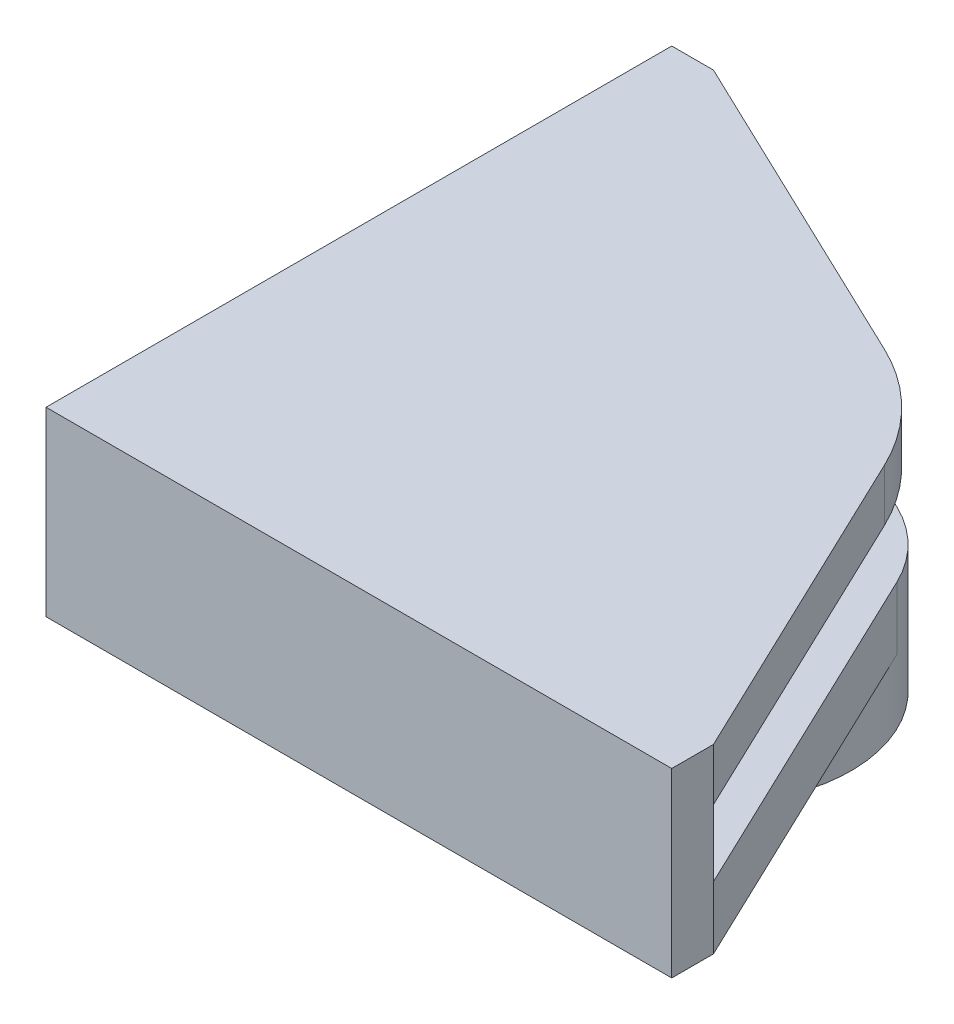
ISO-10303-21;
HEADER;
FILE_DESCRIPTION(('STEP AP214'),'2;1');
FILE_NAME('part.step','',(''),(''),'','','');
FILE_SCHEMA(('AUTOMOTIVE_DESIGN { 1 0 10303 214 1 1 1 1 }'));
ENDSEC;
DATA;
#1=APPLICATION_CONTEXT('core data for automotive mechanical design processes');
#2=APPLICATION_PROTOCOL_DEFINITION('international standard','automotive_design',2000,#1);
#3=PRODUCT_CONTEXT('',#1,'mechanical');
#4=PRODUCT('Part','Part','',(#3));
#5=PRODUCT_RELATED_PRODUCT_CATEGORY('part','',(#4));
#6=PRODUCT_DEFINITION_FORMATION('','',#4);
#7=PRODUCT_DEFINITION_CONTEXT('part definition',#1,'design');
#8=PRODUCT_DEFINITION('design','',#6,#7);
#9=PRODUCT_DEFINITION_SHAPE('','',#8);
#10=(LENGTH_UNIT() NAMED_UNIT(*) SI_UNIT(.MILLI.,.METRE.));
#11=(NAMED_UNIT(*) PLANE_ANGLE_UNIT() SI_UNIT($,.RADIAN.));
#12=(NAMED_UNIT(*) SI_UNIT($,.STERADIAN.) SOLID_ANGLE_UNIT());
#13=UNCERTAINTY_MEASURE_WITH_UNIT(LENGTH_MEASURE(1.E-05),#10,'distance_accuracy_value','');
#14=(GEOMETRIC_REPRESENTATION_CONTEXT(3) GLOBAL_UNCERTAINTY_ASSIGNED_CONTEXT((#13)) GLOBAL_UNIT_ASSIGNED_CONTEXT((#10,
#11,#12)) REPRESENTATION_CONTEXT('',''));
#15=CARTESIAN_POINT('',(0.,0.,0.));
#16=DIRECTION('',(0.,0.,1.));
#17=DIRECTION('',(1.,0.,0.));
#18=AXIS2_PLACEMENT_3D('',#15,#16,#17);
#19=CARTESIAN_POINT('',(14.0000000000001,3.1,-13.9999999999997));
#20=DIRECTION('',(0.,-1.,0.));
#21=DIRECTION('',(0.,0.,-1.));
#22=AXIS2_PLACEMENT_3D('',#19,#20,#21);
#23=CYLINDRICAL_SURFACE('',#22,5.1);
#24=CARTESIAN_POINT('',(14.0000000000001,3.1,-13.9999999999997));
#25=DIRECTION('',(0.,1.,0.));
#26=DIRECTION('',(0.,0.,1.));
#27=AXIS2_PLACEMENT_3D('',#24,#25,#26);
#28=CIRCLE('',#27,5.1);
#29=CARTESIAN_POINT('',(14.0000000000001,3.1,-19.0999999999997));
#30=VERTEX_POINT('',#29);
#31=EDGE_CURVE('E143',#30,#30,#28,.T.);
#32=CARTESIAN_POINT('',(14.0000000000001,0.,-13.9999999999997));
#33=DIRECTION('',(0.,1.,0.));
#34=DIRECTION('',(0.,0.,1.));
#35=AXIS2_PLACEMENT_3D('',#32,#33,#34);
#36=CIRCLE('',#35,5.1);
#37=CARTESIAN_POINT('',(14.0000000000001,0.,-19.0999999999997));
#38=VERTEX_POINT('',#37);
#39=EDGE_CURVE('E199',#38,#38,#36,.T.);
#40=CARTESIAN_POINT('',(14.0000000000001,3.1,-19.0999999999997));
#41=CARTESIAN_POINT('',(14.0000000000001,3.06770833333333,-19.0999999999997));
#42=CARTESIAN_POINT('',(14.0000000000001,3.03541666666667,-19.0999999999997));
#43=CARTESIAN_POINT('',(14.0000000000001,2.97083333333333,-19.0999999999997));
#44=CARTESIAN_POINT('',(14.0000000000001,2.93854166666667,-19.0999999999997));
#45=CARTESIAN_POINT('',(14.0000000000001,2.87395833333333,-19.0999999999997));
#46=CARTESIAN_POINT('',(14.0000000000001,2.84166666666667,-19.0999999999997));
#47=CARTESIAN_POINT('',(14.0000000000001,2.77708333333333,-19.0999999999997));
#48=CARTESIAN_POINT('',(14.0000000000001,2.74479166666667,-19.0999999999997));
#49=CARTESIAN_POINT('',(14.0000000000001,2.68020833333333,-19.0999999999997));
#50=CARTESIAN_POINT('',(14.0000000000001,2.64791666666667,-19.0999999999997));
#51=CARTESIAN_POINT('',(14.0000000000001,2.58333333333333,-19.0999999999997));
#52=CARTESIAN_POINT('',(14.0000000000001,2.55104166666667,-19.0999999999997));
#53=CARTESIAN_POINT('',(14.0000000000001,2.48645833333333,-19.0999999999997));
#54=CARTESIAN_POINT('',(14.0000000000001,2.45416666666667,-19.0999999999997));
#55=CARTESIAN_POINT('',(14.0000000000001,2.38958333333333,-19.0999999999997));
#56=CARTESIAN_POINT('',(14.0000000000001,2.35729166666667,-19.0999999999997));
#57=CARTESIAN_POINT('',(14.0000000000001,2.29270833333333,-19.0999999999997));
#58=CARTESIAN_POINT('',(14.0000000000001,2.26041666666667,-19.0999999999997));
#59=CARTESIAN_POINT('',(14.0000000000001,2.19583333333333,-19.0999999999997));
#60=CARTESIAN_POINT('',(14.0000000000001,2.16354166666667,-19.0999999999997));
#61=CARTESIAN_POINT('',(14.0000000000001,2.09895833333333,-19.0999999999997));
#62=CARTESIAN_POINT('',(14.0000000000001,2.06666666666667,-19.0999999999997));
#63=CARTESIAN_POINT('',(14.0000000000001,2.00208333333333,-19.0999999999997));
#64=CARTESIAN_POINT('',(14.0000000000001,1.96979166666667,-19.0999999999997));
#65=CARTESIAN_POINT('',(14.0000000000001,1.90520833333333,-19.0999999999997));
#66=CARTESIAN_POINT('',(14.0000000000001,1.87291666666667,-19.0999999999997));
#67=CARTESIAN_POINT('',(14.0000000000001,1.80833333333333,-19.0999999999997));
#68=CARTESIAN_POINT('',(14.0000000000001,1.77604166666667,-19.0999999999997));
#69=CARTESIAN_POINT('',(14.0000000000001,1.71145833333333,-19.0999999999997));
#70=CARTESIAN_POINT('',(14.0000000000001,1.67916666666667,-19.0999999999997));
#71=CARTESIAN_POINT('',(14.0000000000001,1.61458333333333,-19.0999999999997));
#72=CARTESIAN_POINT('',(14.0000000000001,1.58229166666667,-19.0999999999997));
#73=CARTESIAN_POINT('',(14.0000000000001,1.51770833333333,-19.0999999999997));
#74=CARTESIAN_POINT('',(14.0000000000001,1.48541666666667,-19.0999999999997));
#75=CARTESIAN_POINT('',(14.0000000000001,1.42083333333333,-19.0999999999997));
#76=CARTESIAN_POINT('',(14.0000000000001,1.38854166666667,-19.0999999999997));
#77=CARTESIAN_POINT('',(14.0000000000001,1.32395833333333,-19.0999999999997));
#78=CARTESIAN_POINT('',(14.0000000000001,1.29166666666667,-19.0999999999997));
#79=CARTESIAN_POINT('',(14.0000000000001,1.22708333333333,-19.0999999999997));
#80=CARTESIAN_POINT('',(14.0000000000001,1.19479166666667,-19.0999999999997));
#81=CARTESIAN_POINT('',(14.0000000000001,1.13020833333333,-19.0999999999997));
#82=CARTESIAN_POINT('',(14.0000000000001,1.09791666666667,-19.0999999999997));
#83=CARTESIAN_POINT('',(14.0000000000001,1.03333333333333,-19.0999999999997));
#84=CARTESIAN_POINT('',(14.0000000000001,1.00104166666667,-19.0999999999997));
#85=CARTESIAN_POINT('',(14.0000000000001,0.936458333333333,-19.0999999999997));
#86=CARTESIAN_POINT('',(14.0000000000001,0.904166666666667,-19.0999999999997));
#87=CARTESIAN_POINT('',(14.0000000000001,0.839583333333334,-19.0999999999997));
#88=CARTESIAN_POINT('',(14.0000000000001,0.807291666666667,-19.0999999999997));
#89=CARTESIAN_POINT('',(14.0000000000001,0.742708333333333,-19.0999999999997));
#90=CARTESIAN_POINT('',(14.0000000000001,0.710416666666667,-19.0999999999997));
#91=CARTESIAN_POINT('',(14.0000000000001,0.645833333333333,-19.0999999999997));
#92=CARTESIAN_POINT('',(14.0000000000001,0.613541666666667,-19.0999999999997));
#93=CARTESIAN_POINT('',(14.0000000000001,0.548958333333333,-19.0999999999997));
#94=CARTESIAN_POINT('',(14.0000000000001,0.516666666666667,-19.0999999999997));
#95=CARTESIAN_POINT('',(14.0000000000001,0.452083333333333,-19.0999999999997));
#96=CARTESIAN_POINT('',(14.0000000000001,0.419791666666667,-19.0999999999997));
#97=CARTESIAN_POINT('',(14.0000000000001,0.355208333333333,-19.0999999999997));
#98=CARTESIAN_POINT('',(14.0000000000001,0.322916666666667,-19.0999999999997));
#99=CARTESIAN_POINT('',(14.0000000000001,0.258333333333333,-19.0999999999997));
#100=CARTESIAN_POINT('',(14.0000000000001,0.226041666666667,-19.0999999999997));
#101=CARTESIAN_POINT('',(14.0000000000001,0.161458333333333,-19.0999999999997));
#102=CARTESIAN_POINT('',(14.0000000000001,0.129166666666667,-19.0999999999997));
#103=CARTESIAN_POINT('',(14.0000000000001,0.0645833333333335,-19.0999999999997));
#104=CARTESIAN_POINT('',(14.0000000000001,0.0322916666666667,-19.0999999999997));
#105=CARTESIAN_POINT('',(14.0000000000001,0.,-19.0999999999997));
#106=B_SPLINE_CURVE_WITH_KNOTS('',3,(#40,#41,#42,#43,#44,#45,#46,#47,#48,#49,#50,#51,#52,#53,
#54,#55,#56,#57,#58,#59,#60,#61,#62,#63,#64,#65,#66,#67,#68,#69,#70,#71,#72,#73,#74,#75,#76,#77,
#78,#79,#80,#81,#82,#83,#84,#85,#86,#87,#88,#89,#90,#91,#92,#93,#94,#95,#96,#97,#98,#99,#100,
#101,#102,#103,#104,#105),.UNSPECIFIED.,.F.,.F.,(4,2,2,2,2,2,2,2,2,2,2,2,2,2,2,2,2,2,2,2,2,2,2,
2,2,2,2,2,2,2,2,2,4),(0.,0.0968750000000002,0.19375,0.290625,0.3875,0.484375,0.58125,0.678125,
0.775,0.871875,0.96875,1.065625,1.1625,1.259375,1.35625,1.453125,1.55,1.646875,1.74375,1.840625,
1.9375,2.034375,2.13125,2.228125,2.325,2.421875,2.51875,2.615625,2.7125,2.809375,2.90625,
3.003125,3.1),.UNSPECIFIED.);
#107=EDGE_CURVE('BSEAM61',#30,#38,#106,.T.);
#108=ORIENTED_EDGE('',*,*,#31,.T.);
#109=ORIENTED_EDGE('',*,*,#39,.F.);
#110=ORIENTED_EDGE('',*,*,#107,.T.);
#111=ORIENTED_EDGE('',*,*,#107,.F.);
#112=EDGE_LOOP('',(#108,#110,#109,#111));
#113=FACE_BOUND('',#112,.T.);
#114=ADVANCED_FACE('F61',(#113),#23,.F.);
#115=CARTESIAN_POINT('',(14.0000000000001,3.1,-13.9999999999997));
#116=DIRECTION('',(0.,-1.,0.));
#117=DIRECTION('',(0.,0.,-1.));
#118=AXIS2_PLACEMENT_3D('',#115,#116,#117);
#119=CYLINDRICAL_SURFACE('',#118,6.6);
#120=CARTESIAN_POINT('',(14.0000000000001,3.1,-13.9999999999997));
#121=DIRECTION('',(0.,1.,0.));
#122=DIRECTION('',(0.,0.,1.));
#123=AXIS2_PLACEMENT_3D('',#120,#121,#122);
#124=CIRCLE('',#123,6.6);
#125=CARTESIAN_POINT('',(16.8442576529718,3.1,-19.9556862244001));
#126=VERTEX_POINT('',#125);
#127=CARTESIAN_POINT('',(19.9556862244004,3.1,-16.8442576529715));
#128=VERTEX_POINT('',#127);
#129=EDGE_CURVE('E12',#126,#128,#124,.T.);
#130=ORIENTED_EDGE('',*,*,#129,.F.);
#131=DIRECTION('',(0.,-1.,0.));
#132=VECTOR('',#131,1.);
#133=CARTESIAN_POINT('',(16.8442576529718,6.1,-19.9556862244001));
#134=LINE('',#133,#132);
#135=CARTESIAN_POINT('',(16.8442576529718,6.1,-19.9556862244001));
#136=VERTEX_POINT('',#135);
#137=EDGE_CURVE('E195',#136,#126,#134,.T.);
#138=ORIENTED_EDGE('',*,*,#137,.F.);
#139=CARTESIAN_POINT('',(14.0000000000001,6.1,-13.9999999999997));
#140=DIRECTION('',(0.,1.,0.));
#141=DIRECTION('',(0.,0.,1.));
#142=AXIS2_PLACEMENT_3D('',#139,#140,#141);
#143=CIRCLE('',#142,6.6);
#144=CARTESIAN_POINT('',(19.9556862244004,6.1,-16.8442576529715));
#145=VERTEX_POINT('',#144);
#146=EDGE_CURVE('E323',#145,#136,#143,.T.);
#147=ORIENTED_EDGE('',*,*,#146,.F.);
#148=DIRECTION('',(0.,-1.,0.));
#149=VECTOR('',#148,1.);
#150=CARTESIAN_POINT('',(19.9556862244004,6.1,-16.8442576529715));
#151=LINE('',#150,#149);
#152=EDGE_CURVE('E118',#145,#128,#151,.T.);
#153=ORIENTED_EDGE('',*,*,#152,.T.);
#154=EDGE_LOOP('',(#130,#138,#147,#153));
#155=FACE_BOUND('',#154,.T.);
#156=CARTESIAN_POINT('',(14.0000000000001,0.,-13.9999999999997));
#157=DIRECTION('',(0.,1.,0.));
#158=DIRECTION('',(0.,0.,1.));
#159=AXIS2_PLACEMENT_3D('',#156,#157,#158);
#160=CIRCLE('',#159,6.6);
#161=CARTESIAN_POINT('',(14.0000000000001,0.,-7.39999999999974));
#162=VERTEX_POINT('',#161);
#163=EDGE_CURVE('E64',#162,#162,#160,.T.);
#164=ORIENTED_EDGE('',*,*,#163,.T.);
#165=EDGE_LOOP('',(#164));
#166=FACE_BOUND('',#165,.T.);
#167=ADVANCED_FACE('F206',(#155,#166),#119,.T.);
#168=CARTESIAN_POINT('',(0.,0.,0.));
#169=DIRECTION('',(0.,1.,0.));
#170=DIRECTION('',(0.,0.,1.));
#171=AXIS2_PLACEMENT_3D('',#168,#169,#170);
#172=PLANE('',#171);
#173=ORIENTED_EDGE('',*,*,#39,.T.);
#174=EDGE_LOOP('',(#173));
#175=FACE_BOUND('',#174,.T.);
#176=ORIENTED_EDGE('',*,*,#163,.F.);
#177=EDGE_LOOP('',(#176));
#178=FACE_BOUND('',#177,.T.);
#179=ADVANCED_FACE('F208',(#175,#178),#172,.F.);
#180=CARTESIAN_POINT('',(0.,6.1,0.));
#181=DIRECTION('',(0.,1.,0.));
#182=DIRECTION('',(0.,0.,1.));
#183=AXIS2_PLACEMENT_3D('',#180,#181,#182);
#184=PLANE('',#183);
#185=DIRECTION('',(-0.430948129238148,0.,-0.902376700666712));
#186=VECTOR('',#185,1.);
#187=CARTESIAN_POINT('',(22.799943877372,6.1,-10.8885714285716));
#188=LINE('',#187,#186);
#189=CARTESIAN_POINT('',(28.0000000000002,6.1,2.48065457064683E-13));
#190=VERTEX_POINT('',#189);
#191=EDGE_CURVE('E178',#190,#145,#188,.T.);
#192=ORIENTED_EDGE('',*,*,#191,.T.);
#193=ORIENTED_EDGE('',*,*,#146,.T.);
#194=DIRECTION('',(0.902376700666716,0.,0.43094812923814));
#195=VECTOR('',#194,1.);
#196=CARTESIAN_POINT('',(10.8885714285713,6.1,-22.7999438773719));
#197=LINE('',#196,#195);
#198=CARTESIAN_POINT('',(0.,6.1,-27.9999999999997));
#199=VERTEX_POINT('',#198);
#200=EDGE_CURVE('E306',#199,#136,#197,.T.);
#201=ORIENTED_EDGE('',*,*,#200,.F.);
#202=DIRECTION('',(0.,0.,-1.));
#203=VECTOR('',#202,1.);
#204=CARTESIAN_POINT('',(0.,6.1,0.));
#205=LINE('',#204,#203);
#206=CARTESIAN_POINT('',(0.,6.1,0.));
#207=VERTEX_POINT('',#206);
#208=EDGE_CURVE('E300',#207,#199,#205,.T.);
#209=ORIENTED_EDGE('',*,*,#208,.F.);
#210=DIRECTION('',(-1.,0.,0.));
#211=VECTOR('',#210,1.);
#212=CARTESIAN_POINT('',(0.,6.1,0.));
#213=LINE('',#212,#211);
#214=EDGE_CURVE('E296',#190,#207,#213,.T.);
#215=ORIENTED_EDGE('',*,*,#214,.F.);
#216=EDGE_LOOP('',(#192,#193,#201,#209,#215));
#217=FACE_BOUND('',#216,.T.);
#218=DIRECTION('',(0.500000000000004,0.,-0.866025403784437));
#219=VECTOR('',#218,1.);
#220=CARTESIAN_POINT('',(12.232050807569,6.1,7.06217782649119));
#221=LINE('',#220,#219);
#222=CARTESIAN_POINT('',(18.6188021535172,6.1,-4.));
#223=VERTEX_POINT('',#222);
#224=CARTESIAN_POINT('',(21.4945782756433,6.1,-8.98099035471578));
#225=VERTEX_POINT('',#224);
#226=EDGE_CURVE('E329',#223,#225,#221,.T.);
#227=ORIENTED_EDGE('',*,*,#226,.T.);
#228=DIRECTION('',(0.430948129238149,0.,0.902376700666712));
#229=VECTOR('',#228,1.);
#230=CARTESIAN_POINT('',(20.9951904760386,6.1,-10.0266751700953));
#231=LINE('',#230,#229);
#232=CARTESIAN_POINT('',(23.8733503267525,6.1,-4.));
#233=VERTEX_POINT('',#232);
#234=EDGE_CURVE('E332',#225,#233,#231,.T.);
#235=ORIENTED_EDGE('',*,*,#234,.T.);
#236=DIRECTION('',(-1.,0.,0.));
#237=VECTOR('',#236,1.);
#238=CARTESIAN_POINT('',(0.,6.1,-3.99999999999999));
#239=LINE('',#238,#237);
#240=EDGE_CURVE('E151',#233,#223,#239,.T.);
#241=ORIENTED_EDGE('',*,*,#240,.T.);
#242=EDGE_LOOP('',(#227,#235,#241));
#243=FACE_BOUND('',#242,.T.);
#244=DIRECTION('',(0.86602540378445,0.,-0.499999999999981));
#245=VECTOR('',#244,1.);
#246=CARTESIAN_POINT('',(-7.06217782649088,6.1,-12.2320508075692));
#247=LINE('',#246,#245);
#248=CARTESIAN_POINT('',(4.00000000000049,6.1,-18.6188021535171));
#249=VERTEX_POINT('',#248);
#250=CARTESIAN_POINT('',(8.98099035471634,6.1,-21.4945782756431));
#251=VERTEX_POINT('',#250);
#252=EDGE_CURVE('E136',#249,#251,#247,.T.);
#253=ORIENTED_EDGE('',*,*,#252,.F.);
#254=DIRECTION('',(0.,0.,1.));
#255=VECTOR('',#254,1.);
#256=CARTESIAN_POINT('',(4.,6.1,1.05644004776684E-13));
#257=LINE('',#256,#255);
#258=CARTESIAN_POINT('',(4.00000000000063,6.1,-23.8733503267524));
#259=VERTEX_POINT('',#258);
#260=EDGE_CURVE('E149',#259,#249,#257,.T.);
#261=ORIENTED_EDGE('',*,*,#260,.F.);
#262=DIRECTION('',(-0.902376700666701,0.,-0.430948129238172));
#263=VECTOR('',#262,1.);
#264=CARTESIAN_POINT('',(10.0266751700958,6.1,-20.9951904760383));
#265=LINE('',#264,#263);
#266=EDGE_CURVE('E150',#251,#259,#265,.T.);
#267=ORIENTED_EDGE('',*,*,#266,.F.);
#268=EDGE_LOOP('',(#253,#261,#267));
#269=FACE_BOUND('',#268,.T.);
#270=ADVANCED_FACE('F148',(#217,#243,#269),#184,.T.);
#271=CARTESIAN_POINT('',(22.799943877372,6.1,-10.8885714285716));
#272=DIRECTION('',(-0.902376700666712,0.,0.430948129238148));
#273=DIRECTION('',(0.430948129238148,0.,0.902376700666712));
#274=AXIS2_PLACEMENT_3D('',#271,#272,#273);
#275=PLANE('',#274);
#276=DIRECTION('',(-0.430948129238148,0.,-0.902376700666712));
#277=VECTOR('',#276,1.);
#278=CARTESIAN_POINT('',(22.799943877372,3.1,-10.8885714285716));
#279=LINE('',#278,#277);
#280=CARTESIAN_POINT('',(28.0000000000002,3.1,2.48065457064683E-13));
#281=VERTEX_POINT('',#280);
#282=EDGE_CURVE('E159',#281,#128,#279,.T.);
#283=ORIENTED_EDGE('',*,*,#282,.T.);
#284=ORIENTED_EDGE('',*,*,#152,.F.);
#285=ORIENTED_EDGE('',*,*,#191,.F.);
#286=DIRECTION('',(0.,-1.,0.));
#287=VECTOR('',#286,1.);
#288=CARTESIAN_POINT('',(28.0000000000002,6.1,2.48065457064683E-13));
#289=LINE('',#288,#287);
#290=EDGE_CURVE('E155',#190,#281,#289,.T.);
#291=ORIENTED_EDGE('',*,*,#290,.T.);
#292=EDGE_LOOP('',(#283,#284,#285,#291));
#293=FACE_BOUND('',#292,.T.);
#294=ADVANCED_FACE('F215',(#293),#275,.F.);
#295=CARTESIAN_POINT('',(10.8885714285713,6.1,-22.7999438773719));
#296=DIRECTION('',(0.43094812923814,0.,-0.902376700666715));
#297=DIRECTION('',(-0.902376700666716,0.,-0.43094812923814));
#298=AXIS2_PLACEMENT_3D('',#295,#296,#297);
#299=PLANE('',#298);
#300=DIRECTION('',(0.902376700666716,0.,0.43094812923814));
#301=VECTOR('',#300,1.);
#302=CARTESIAN_POINT('',(10.8885714285713,3.1,-22.7999438773719));
#303=LINE('',#302,#301);
#304=CARTESIAN_POINT('',(0.,3.1,-27.9999999999997));
#305=VERTEX_POINT('',#304);
#306=EDGE_CURVE('E161',#305,#126,#303,.T.);
#307=ORIENTED_EDGE('',*,*,#306,.F.);
#308=DIRECTION('',(0.,-1.,0.));
#309=VECTOR('',#308,1.);
#310=CARTESIAN_POINT('',(0.,6.1,-27.9999999999997));
#311=LINE('',#310,#309);
#312=EDGE_CURVE('E192',#199,#305,#311,.T.);
#313=ORIENTED_EDGE('',*,*,#312,.F.);
#314=ORIENTED_EDGE('',*,*,#200,.T.);
#315=ORIENTED_EDGE('',*,*,#137,.T.);
#316=EDGE_LOOP('',(#307,#313,#314,#315));
#317=FACE_BOUND('',#316,.T.);
#318=ADVANCED_FACE('F258',(#317),#299,.T.);
#319=CARTESIAN_POINT('',(12.232050807569,6.1,7.06217782649119));
#320=DIRECTION('',(-0.866025403784437,0.,-0.500000000000004));
#321=DIRECTION('',(-0.500000000000004,0.,0.866025403784437));
#322=AXIS2_PLACEMENT_3D('',#319,#320,#321);
#323=PLANE('',#322);
#324=DIRECTION('',(0.500000000000004,0.,-0.866025403784437));
#325=VECTOR('',#324,1.);
#326=CARTESIAN_POINT('',(12.232050807569,3.1,7.06217782649119));
#327=LINE('',#326,#325);
#328=CARTESIAN_POINT('',(18.6188021535172,3.1,-4.));
#329=VERTEX_POINT('',#328);
#330=CARTESIAN_POINT('',(21.4945782756433,3.1,-8.98099035471578));
#331=VERTEX_POINT('',#330);
#332=EDGE_CURVE('E165',#329,#331,#327,.T.);
#333=ORIENTED_EDGE('',*,*,#332,.T.);
#334=DIRECTION('',(0.,-1.,0.));
#335=VECTOR('',#334,1.);
#336=CARTESIAN_POINT('',(21.4945782756433,6.1,-8.98099035471578));
#337=LINE('',#336,#335);
#338=EDGE_CURVE('E180',#225,#331,#337,.T.);
#339=ORIENTED_EDGE('',*,*,#338,.F.);
#340=ORIENTED_EDGE('',*,*,#226,.F.);
#341=DIRECTION('',(0.,-1.,0.));
#342=VECTOR('',#341,1.);
#343=CARTESIAN_POINT('',(18.6188021535172,6.1,-4.));
#344=LINE('',#343,#342);
#345=EDGE_CURVE('E182',#223,#329,#344,.T.);
#346=ORIENTED_EDGE('',*,*,#345,.T.);
#347=EDGE_LOOP('',(#333,#339,#340,#346));
#348=FACE_BOUND('',#347,.T.);
#349=ADVANCED_FACE('F251',(#348),#323,.F.);
#350=CARTESIAN_POINT('',(0.,6.1,-3.99999999999999));
#351=DIRECTION('',(0.,0.,1.));
#352=DIRECTION('',(1.,0.,0.));
#353=AXIS2_PLACEMENT_3D('',#350,#351,#352);
#354=PLANE('',#353);
#355=DIRECTION('',(-1.,0.,0.));
#356=VECTOR('',#355,1.);
#357=CARTESIAN_POINT('',(0.,3.1,-3.99999999999999));
#358=LINE('',#357,#356);
#359=CARTESIAN_POINT('',(23.8733503267525,3.1,-4.));
#360=VERTEX_POINT('',#359);
#361=EDGE_CURVE('E170',#360,#329,#358,.T.);
#362=ORIENTED_EDGE('',*,*,#361,.T.);
#363=ORIENTED_EDGE('',*,*,#345,.F.);
#364=ORIENTED_EDGE('',*,*,#240,.F.);
#365=DIRECTION('',(0.,-1.,0.));
#366=VECTOR('',#365,1.);
#367=CARTESIAN_POINT('',(23.8733503267525,6.1,-4.));
#368=LINE('',#367,#366);
#369=EDGE_CURVE('E185',#233,#360,#368,.T.);
#370=ORIENTED_EDGE('',*,*,#369,.T.);
#371=EDGE_LOOP('',(#362,#363,#364,#370));
#372=FACE_BOUND('',#371,.T.);
#373=ADVANCED_FACE('F248',(#372),#354,.F.);
#374=CARTESIAN_POINT('',(20.9951904760386,6.1,-10.0266751700953));
#375=DIRECTION('',(0.902376700666711,0.,-0.430948129238149));
#376=DIRECTION('',(-0.430948129238149,0.,-0.902376700666712));
#377=AXIS2_PLACEMENT_3D('',#374,#375,#376);
#378=PLANE('',#377);
#379=DIRECTION('',(0.430948129238149,0.,0.902376700666712));
#380=VECTOR('',#379,1.);
#381=CARTESIAN_POINT('',(20.9951904760386,3.1,-10.0266751700953));
#382=LINE('',#381,#380);
#383=EDGE_CURVE('E168',#331,#360,#382,.T.);
#384=ORIENTED_EDGE('',*,*,#383,.T.);
#385=ORIENTED_EDGE('',*,*,#369,.F.);
#386=ORIENTED_EDGE('',*,*,#234,.F.);
#387=ORIENTED_EDGE('',*,*,#338,.T.);
#388=EDGE_LOOP('',(#384,#385,#386,#387));
#389=FACE_BOUND('',#388,.T.);
#390=ADVANCED_FACE('F247',(#389),#378,.F.);
#391=CARTESIAN_POINT('',(-7.06217782649088,6.1,-12.2320508075692));
#392=DIRECTION('',(-0.499999999999981,0.,-0.866025403784449));
#393=DIRECTION('',(-0.86602540378445,0.,0.499999999999981));
#394=AXIS2_PLACEMENT_3D('',#391,#392,#393);
#395=PLANE('',#394);
#396=DIRECTION('',(0.86602540378445,0.,-0.499999999999981));
#397=VECTOR('',#396,1.);
#398=CARTESIAN_POINT('',(-7.06217782649088,3.1,-12.2320508075692));
#399=LINE('',#398,#397);
#400=CARTESIAN_POINT('',(4.00000000000049,3.1,-18.6188021535171));
#401=VERTEX_POINT('',#400);
#402=CARTESIAN_POINT('',(8.98099035471634,3.1,-21.4945782756431));
#403=VERTEX_POINT('',#402);
#404=EDGE_CURVE('E138',#401,#403,#399,.T.);
#405=ORIENTED_EDGE('',*,*,#404,.F.);
#406=DIRECTION('',(0.,-1.,0.));
#407=VECTOR('',#406,1.);
#408=CARTESIAN_POINT('',(4.00000000000049,6.1,-18.6188021535171));
#409=LINE('',#408,#407);
#410=EDGE_CURVE('E133',#249,#401,#409,.T.);
#411=ORIENTED_EDGE('',*,*,#410,.F.);
#412=ORIENTED_EDGE('',*,*,#252,.T.);
#413=DIRECTION('',(0.,-1.,0.));
#414=VECTOR('',#413,1.);
#415=CARTESIAN_POINT('',(8.98099035471634,6.1,-21.4945782756431));
#416=LINE('',#415,#414);
#417=EDGE_CURVE('E83',#251,#403,#416,.T.);
#418=ORIENTED_EDGE('',*,*,#417,.T.);
#419=EDGE_LOOP('',(#405,#411,#412,#418));
#420=FACE_BOUND('',#419,.T.);
#421=ADVANCED_FACE('F135',(#420),#395,.T.);
#422=CARTESIAN_POINT('',(10.0266751700958,6.1,-20.9951904760383));
#423=DIRECTION('',(-0.430948129238172,0.,0.9023767006667));
#424=DIRECTION('',(0.902376700666701,0.,0.430948129238172));
#425=AXIS2_PLACEMENT_3D('',#422,#423,#424);
#426=PLANE('',#425);
#427=DIRECTION('',(-0.902376700666701,0.,-0.430948129238172));
#428=VECTOR('',#427,1.);
#429=CARTESIAN_POINT('',(10.0266751700958,3.1,-20.9951904760383));
#430=LINE('',#429,#428);
#431=CARTESIAN_POINT('',(4.00000000000063,3.1,-23.8733503267524));
#432=VERTEX_POINT('',#431);
#433=EDGE_CURVE('E175',#403,#432,#430,.T.);
#434=ORIENTED_EDGE('',*,*,#433,.F.);
#435=ORIENTED_EDGE('',*,*,#417,.F.);
#436=ORIENTED_EDGE('',*,*,#266,.T.);
#437=DIRECTION('',(0.,-1.,0.));
#438=VECTOR('',#437,1.);
#439=CARTESIAN_POINT('',(4.00000000000063,6.1,-23.8733503267524));
#440=LINE('',#439,#438);
#441=EDGE_CURVE('E144',#259,#432,#440,.T.);
#442=ORIENTED_EDGE('',*,*,#441,.T.);
#443=EDGE_LOOP('',(#434,#435,#436,#442));
#444=FACE_BOUND('',#443,.T.);
#445=ADVANCED_FACE('F240',(#444),#426,.T.);
#446=CARTESIAN_POINT('',(4.,6.1,1.05644004776684E-13));
#447=DIRECTION('',(1.,0.,0.));
#448=DIRECTION('',(0.,0.,-1.));
#449=AXIS2_PLACEMENT_3D('',#446,#447,#448);
#450=PLANE('',#449);
#451=DIRECTION('',(0.,0.,1.));
#452=VECTOR('',#451,1.);
#453=CARTESIAN_POINT('',(4.,3.1,1.05644004776684E-13));
#454=LINE('',#453,#452);
#455=EDGE_CURVE('E173',#432,#401,#454,.T.);
#456=ORIENTED_EDGE('',*,*,#455,.F.);
#457=ORIENTED_EDGE('',*,*,#441,.F.);
#458=ORIENTED_EDGE('',*,*,#260,.T.);
#459=ORIENTED_EDGE('',*,*,#410,.T.);
#460=EDGE_LOOP('',(#456,#457,#458,#459));
#461=FACE_BOUND('',#460,.T.);
#462=ADVANCED_FACE('F153',(#461),#450,.T.);
#463=CARTESIAN_POINT('',(0.,3.1,0.));
#464=DIRECTION('',(0.,1.,0.));
#465=DIRECTION('',(0.,0.,1.));
#466=AXIS2_PLACEMENT_3D('',#463,#464,#465);
#467=PLANE('',#466);
#468=DIRECTION('',(-1.,0.,0.));
#469=VECTOR('',#468,1.);
#470=CARTESIAN_POINT('',(0.,3.1,-27.9999999999997));
#471=LINE('',#470,#469);
#472=CARTESIAN_POINT('',(-2.,3.1,-27.9999999999997));
#473=VERTEX_POINT('',#472);
#474=EDGE_CURVE('E363',#305,#473,#471,.T.);
#475=ORIENTED_EDGE('',*,*,#474,.F.);
#476=ORIENTED_EDGE('',*,*,#306,.T.);
#477=ORIENTED_EDGE('',*,*,#129,.T.);
#478=ORIENTED_EDGE('',*,*,#282,.F.);
#479=DIRECTION('',(0.,0.,-1.));
#480=VECTOR('',#479,1.);
#481=CARTESIAN_POINT('',(28.0000000000002,3.1,2.00000000000025));
#482=LINE('',#481,#480);
#483=CARTESIAN_POINT('',(28.0000000000002,3.1,2.00000000000025));
#484=VERTEX_POINT('',#483);
#485=EDGE_CURVE('E274',#484,#281,#482,.T.);
#486=ORIENTED_EDGE('',*,*,#485,.F.);
#487=DIRECTION('',(1.,0.,0.));
#488=VECTOR('',#487,1.);
#489=CARTESIAN_POINT('',(-2.,3.1,2.00000000000025));
#490=LINE('',#489,#488);
#491=CARTESIAN_POINT('',(-2.,3.1,2.00000000000025));
#492=VERTEX_POINT('',#491);
#493=EDGE_CURVE('E358',#492,#484,#490,.T.);
#494=ORIENTED_EDGE('',*,*,#493,.F.);
#495=DIRECTION('',(0.,0.,1.));
#496=VECTOR('',#495,1.);
#497=CARTESIAN_POINT('',(-2.,3.1,-27.9999999999997));
#498=LINE('',#497,#496);
#499=EDGE_CURVE('E360',#473,#492,#498,.T.);
#500=ORIENTED_EDGE('',*,*,#499,.F.);
#501=EDGE_LOOP('',(#475,#476,#477,#478,#486,#494,#500));
#502=FACE_BOUND('',#501,.T.);
#503=ORIENTED_EDGE('',*,*,#332,.F.);
#504=ORIENTED_EDGE('',*,*,#361,.F.);
#505=ORIENTED_EDGE('',*,*,#383,.F.);
#506=EDGE_LOOP('',(#503,#504,#505));
#507=FACE_BOUND('',#506,.T.);
#508=ORIENTED_EDGE('',*,*,#404,.T.);
#509=ORIENTED_EDGE('',*,*,#433,.T.);
#510=ORIENTED_EDGE('',*,*,#455,.T.);
#511=EDGE_LOOP('',(#508,#509,#510));
#512=FACE_BOUND('',#511,.T.);
#513=ADVANCED_FACE('F229',(#502,#507,#512),#467,.F.);
#514=ORIENTED_EDGE('',*,*,#31,.F.);
#515=EDGE_LOOP('',(#514));
#516=FACE_BOUND('',#515,.T.);
#517=ADVANCED_FACE('F226',(#516),#467,.F.);
#518=CARTESIAN_POINT('',(0.,9.3,-27.9999999999997));
#519=DIRECTION('',(-1.,0.,0.));
#520=DIRECTION('',(0.,0.,1.));
#521=AXIS2_PLACEMENT_3D('',#518,#519,#520);
#522=PLANE('',#521);
#523=ORIENTED_EDGE('',*,*,#208,.T.);
#524=DIRECTION('',(0.,-1.,0.));
#525=VECTOR('',#524,1.);
#526=CARTESIAN_POINT('',(0.,9.3,-27.9999999999997));
#527=LINE('',#526,#525);
#528=CARTESIAN_POINT('',(0.,9.3,-27.9999999999997));
#529=VERTEX_POINT('',#528);
#530=EDGE_CURVE('E162',#529,#199,#527,.T.);
#531=ORIENTED_EDGE('',*,*,#530,.F.);
#532=DIRECTION('',(0.,0.,-1.));
#533=VECTOR('',#532,1.);
#534=CARTESIAN_POINT('',(0.,9.3,-27.9999999999997));
#535=LINE('',#534,#533);
#536=CARTESIAN_POINT('',(0.,9.3,0.));
#537=VERTEX_POINT('',#536);
#538=EDGE_CURVE('E355',#537,#529,#535,.T.);
#539=ORIENTED_EDGE('',*,*,#538,.F.);
#540=DIRECTION('',(0.,-1.,0.));
#541=VECTOR('',#540,1.);
#542=CARTESIAN_POINT('',(0.,9.3,0.));
#543=LINE('',#542,#541);
#544=EDGE_CURVE('E304',#537,#207,#543,.T.);
#545=ORIENTED_EDGE('',*,*,#544,.T.);
#546=EDGE_LOOP('',(#523,#531,#539,#545));
#547=FACE_BOUND('',#546,.T.);
#548=ADVANCED_FACE('F228',(#547),#522,.F.);
#549=CARTESIAN_POINT('',(0.,9.3,-27.9999999999997));
#550=DIRECTION('',(0.,0.,1.));
#551=DIRECTION('',(1.,0.,0.));
#552=AXIS2_PLACEMENT_3D('',#549,#550,#551);
#553=PLANE('',#552);
#554=ORIENTED_EDGE('',*,*,#530,.T.);
#555=ORIENTED_EDGE('',*,*,#312,.T.);
#556=ORIENTED_EDGE('',*,*,#474,.T.);
#557=DIRECTION('',(0.,-1.,0.));
#558=VECTOR('',#557,1.);
#559=CARTESIAN_POINT('',(-2.,9.3,-27.9999999999997));
#560=LINE('',#559,#558);
#561=CARTESIAN_POINT('',(-2.,11.8,-27.9999999999997));
#562=VERTEX_POINT('',#561);
#563=EDGE_CURVE('E316',#562,#473,#560,.T.);
#564=ORIENTED_EDGE('',*,*,#563,.F.);
#565=DIRECTION('',(-1.,0.,0.));
#566=VECTOR('',#565,1.);
#567=CARTESIAN_POINT('',(-2.,11.8,-27.9999999999997));
#568=LINE('',#567,#566);
#569=CARTESIAN_POINT('',(0.,11.8,-27.9999999999997));
#570=VERTEX_POINT('',#569);
#571=EDGE_CURVE('E375',#570,#562,#568,.T.);
#572=ORIENTED_EDGE('',*,*,#571,.F.);
#573=DIRECTION('',(0.,-1.,0.));
#574=VECTOR('',#573,1.);
#575=CARTESIAN_POINT('',(0.,11.8,-27.9999999999997));
#576=LINE('',#575,#574);
#577=EDGE_CURVE('E315',#570,#529,#576,.T.);
#578=ORIENTED_EDGE('',*,*,#577,.T.);
#579=EDGE_LOOP('',(#554,#555,#556,#564,#572,#578));
#580=FACE_BOUND('',#579,.T.);
#581=ADVANCED_FACE('F235',(#580),#553,.F.);
#582=CARTESIAN_POINT('',(-2.,9.3,-27.9999999999997));
#583=DIRECTION('',(1.,0.,0.));
#584=DIRECTION('',(0.,0.,-1.));
#585=AXIS2_PLACEMENT_3D('',#582,#583,#584);
#586=PLANE('',#585);
#587=ORIENTED_EDGE('',*,*,#563,.T.);
#588=ORIENTED_EDGE('',*,*,#499,.T.);
#589=DIRECTION('',(0.,-1.,0.));
#590=VECTOR('',#589,1.);
#591=CARTESIAN_POINT('',(-2.,9.3,2.00000000000025));
#592=LINE('',#591,#590);
#593=CARTESIAN_POINT('',(-2.,11.8,2.00000000000025));
#594=VERTEX_POINT('',#593);
#595=EDGE_CURVE('E344',#594,#492,#592,.T.);
#596=ORIENTED_EDGE('',*,*,#595,.F.);
#597=DIRECTION('',(0.,0.,1.));
#598=VECTOR('',#597,1.);
#599=CARTESIAN_POINT('',(-2.,11.8,2.00000000000025));
#600=LINE('',#599,#598);
#601=EDGE_CURVE('E379',#562,#594,#600,.T.);
#602=ORIENTED_EDGE('',*,*,#601,.F.);
#603=EDGE_LOOP('',(#587,#588,#596,#602));
#604=FACE_BOUND('',#603,.T.);
#605=ADVANCED_FACE('F416',(#604),#586,.F.);
#606=CARTESIAN_POINT('',(-2.,9.3,2.00000000000025));
#607=DIRECTION('',(0.,0.,-1.));
#608=DIRECTION('',(-1.,0.,0.));
#609=AXIS2_PLACEMENT_3D('',#606,#607,#608);
#610=PLANE('',#609);
#611=ORIENTED_EDGE('',*,*,#595,.T.);
#612=ORIENTED_EDGE('',*,*,#493,.T.);
#613=DIRECTION('',(0.,-1.,0.));
#614=VECTOR('',#613,1.);
#615=CARTESIAN_POINT('',(28.0000000000002,9.3,2.00000000000025));
#616=LINE('',#615,#614);
#617=CARTESIAN_POINT('',(28.0000000000002,11.8,2.00000000000025));
#618=VERTEX_POINT('',#617);
#619=EDGE_CURVE('E347',#618,#484,#616,.T.);
#620=ORIENTED_EDGE('',*,*,#619,.F.);
#621=DIRECTION('',(1.,0.,0.));
#622=VECTOR('',#621,1.);
#623=CARTESIAN_POINT('',(28.0000000000002,11.8,2.00000000000025));
#624=LINE('',#623,#622);
#625=EDGE_CURVE('E400',#594,#618,#624,.T.);
#626=ORIENTED_EDGE('',*,*,#625,.F.);
#627=EDGE_LOOP('',(#611,#612,#620,#626));
#628=FACE_BOUND('',#627,.T.);
#629=ADVANCED_FACE('F433',(#628),#610,.F.);
#630=CARTESIAN_POINT('',(28.0000000000002,9.3,2.00000000000025));
#631=DIRECTION('',(-1.,0.,0.));
#632=DIRECTION('',(0.,0.,1.));
#633=AXIS2_PLACEMENT_3D('',#630,#631,#632);
#634=PLANE('',#633);
#635=ORIENTED_EDGE('',*,*,#619,.T.);
#636=ORIENTED_EDGE('',*,*,#485,.T.);
#637=ORIENTED_EDGE('',*,*,#290,.F.);
#638=DIRECTION('',(0.,-1.,0.));
#639=VECTOR('',#638,1.);
#640=CARTESIAN_POINT('',(28.0000000000002,9.3,2.48065457064683E-13));
#641=LINE('',#640,#639);
#642=CARTESIAN_POINT('',(28.0000000000002,9.3,2.48065457064683E-13));
#643=VERTEX_POINT('',#642);
#644=EDGE_CURVE('E349',#643,#190,#641,.T.);
#645=ORIENTED_EDGE('',*,*,#644,.F.);
#646=DIRECTION('',(0.,-1.,0.));
#647=VECTOR('',#646,1.);
#648=CARTESIAN_POINT('',(28.0000000000002,11.8,2.48065457064683E-13));
#649=LINE('',#648,#647);
#650=CARTESIAN_POINT('',(28.0000000000002,11.8,2.48065457064683E-13));
#651=VERTEX_POINT('',#650);
#652=EDGE_CURVE('E365',#651,#643,#649,.T.);
#653=ORIENTED_EDGE('',*,*,#652,.F.);
#654=DIRECTION('',(0.,0.,-1.));
#655=VECTOR('',#654,1.);
#656=CARTESIAN_POINT('',(28.0000000000002,11.8,2.48065457064683E-13));
#657=LINE('',#656,#655);
#658=EDGE_CURVE('E397',#618,#651,#657,.T.);
#659=ORIENTED_EDGE('',*,*,#658,.F.);
#660=EDGE_LOOP('',(#635,#636,#637,#645,#653,#659));
#661=FACE_BOUND('',#660,.T.);
#662=ADVANCED_FACE('F437',(#661),#634,.F.);
#663=CARTESIAN_POINT('',(0.,9.3,0.));
#664=DIRECTION('',(0.,0.,1.));
#665=DIRECTION('',(1.,0.,0.));
#666=AXIS2_PLACEMENT_3D('',#663,#664,#665);
#667=PLANE('',#666);
#668=ORIENTED_EDGE('',*,*,#214,.T.);
#669=ORIENTED_EDGE('',*,*,#544,.F.);
#670=DIRECTION('',(-1.,0.,0.));
#671=VECTOR('',#670,1.);
#672=CARTESIAN_POINT('',(0.,9.3,0.));
#673=LINE('',#672,#671);
#674=EDGE_CURVE('E352',#643,#537,#673,.T.);
#675=ORIENTED_EDGE('',*,*,#674,.F.);
#676=ORIENTED_EDGE('',*,*,#644,.T.);
#677=EDGE_LOOP('',(#668,#669,#675,#676));
#678=FACE_BOUND('',#677,.T.);
#679=ADVANCED_FACE('F457',(#678),#667,.F.);
#680=CARTESIAN_POINT('',(20.5042251272481,11.8,-15.6956536986763));
#681=DIRECTION('',(-0.902376700666712,0.,0.430948129238148));
#682=DIRECTION('',(0.430948129238148,0.,0.902376700666712));
#683=AXIS2_PLACEMENT_3D('',#680,#681,#682);
#684=PLANE('',#683);
#685=DIRECTION('',(-0.430948129238148,0.,-0.902376700666712));
#686=VECTOR('',#685,1.);
#687=CARTESIAN_POINT('',(20.5042251272481,9.3,-15.6956536986763));
#688=LINE('',#687,#686);
#689=CARTESIAN_POINT('',(20.5042251272481,9.3,-15.6956536986763));
#690=VERTEX_POINT('',#689);
#691=EDGE_CURVE('E383',#643,#690,#688,.T.);
#692=ORIENTED_EDGE('',*,*,#691,.T.);
#693=DIRECTION('',(0.,-1.,0.));
#694=VECTOR('',#693,1.);
#695=CARTESIAN_POINT('',(20.5042251272481,11.8,-15.6956536986763));
#696=LINE('',#695,#694);
#697=CARTESIAN_POINT('',(20.5042251272481,11.8,-15.6956536986763));
#698=VERTEX_POINT('',#697);
#699=EDGE_CURVE('E368',#698,#690,#696,.T.);
#700=ORIENTED_EDGE('',*,*,#699,.F.);
#701=DIRECTION('',(-0.430948129238148,0.,-0.902376700666712));
#702=VECTOR('',#701,1.);
#703=CARTESIAN_POINT('',(20.5042251272481,11.8,-15.6956536986763));
#704=LINE('',#703,#702);
#705=EDGE_CURVE('E394',#651,#698,#704,.T.);
#706=ORIENTED_EDGE('',*,*,#705,.F.);
#707=ORIENTED_EDGE('',*,*,#652,.T.);
#708=EDGE_LOOP('',(#692,#700,#706,#707));
#709=FACE_BOUND('',#708,.T.);
#710=ADVANCED_FACE('F459',(#709),#684,.F.);
#711=CARTESIAN_POINT('',(11.2999827804476,11.8,-11.2999827804473));
#712=DIRECTION('',(0.,-1.,0.));
#713=DIRECTION('',(0.,0.,-1.));
#714=AXIS2_PLACEMENT_3D('',#711,#712,#713);
#715=CYLINDRICAL_SURFACE('',#714,10.2);
#716=CARTESIAN_POINT('',(11.2999827804476,9.3,-11.2999827804473));
#717=DIRECTION('',(0.,1.,0.));
#718=DIRECTION('',(0.,0.,-1.));
#719=AXIS2_PLACEMENT_3D('',#716,#717,#718);
#720=CIRCLE('',#719,10.2);
#721=CARTESIAN_POINT('',(15.6956536986766,9.3,-20.5042251272478));
#722=VERTEX_POINT('',#721);
#723=EDGE_CURVE('E380',#690,#722,#720,.T.);
#724=ORIENTED_EDGE('',*,*,#723,.T.);
#725=DIRECTION('',(0.,-1.,0.));
#726=VECTOR('',#725,1.);
#727=CARTESIAN_POINT('',(15.6956536986766,11.8,-20.5042251272478));
#728=LINE('',#727,#726);
#729=CARTESIAN_POINT('',(15.6956536986766,11.8,-20.5042251272478));
#730=VERTEX_POINT('',#729);
#731=EDGE_CURVE('E371',#730,#722,#728,.T.);
#732=ORIENTED_EDGE('',*,*,#731,.F.);
#733=CARTESIAN_POINT('',(11.2999827804476,11.8,-11.2999827804473));
#734=DIRECTION('',(0.,1.,0.));
#735=DIRECTION('',(0.,0.,-1.));
#736=AXIS2_PLACEMENT_3D('',#733,#734,#735);
#737=CIRCLE('',#736,10.2);
#738=EDGE_CURVE('E391',#698,#730,#737,.T.);
#739=ORIENTED_EDGE('',*,*,#738,.F.);
#740=ORIENTED_EDGE('',*,*,#699,.T.);
#741=EDGE_LOOP('',(#724,#732,#739,#740));
#742=FACE_BOUND('',#741,.T.);
#743=ADVANCED_FACE('F448',(#742),#715,.T.);
#744=CARTESIAN_POINT('',(0.,11.8,-27.9999999999997));
#745=DIRECTION('',(-0.43094812923814,0.,0.902376700666715));
#746=DIRECTION('',(0.902376700666715,0.,0.43094812923814));
#747=AXIS2_PLACEMENT_3D('',#744,#745,#746);
#748=PLANE('',#747);
#749=DIRECTION('',(-0.902376700666715,0.,-0.43094812923814));
#750=VECTOR('',#749,1.);
#751=CARTESIAN_POINT('',(0.,9.3,-27.9999999999997));
#752=LINE('',#751,#750);
#753=EDGE_CURVE('E376',#722,#529,#752,.T.);
#754=ORIENTED_EDGE('',*,*,#753,.T.);
#755=ORIENTED_EDGE('',*,*,#577,.F.);
#756=DIRECTION('',(-0.902376700666715,0.,-0.43094812923814));
#757=VECTOR('',#756,1.);
#758=CARTESIAN_POINT('',(0.,11.8,-27.9999999999997));
#759=LINE('',#758,#757);
#760=EDGE_CURVE('E388',#730,#570,#759,.T.);
#761=ORIENTED_EDGE('',*,*,#760,.F.);
#762=ORIENTED_EDGE('',*,*,#731,.T.);
#763=EDGE_LOOP('',(#754,#755,#761,#762));
#764=FACE_BOUND('',#763,.T.);
#765=ADVANCED_FACE('F452',(#764),#748,.F.);
#766=CARTESIAN_POINT('',(11.2999827804476,11.8,-11.2999827804473));
#767=DIRECTION('',(0.,-1.,0.));
#768=DIRECTION('',(0.,0.,-1.));
#769=AXIS2_PLACEMENT_3D('',#766,#767,#768);
#770=PLANE('',#769);
#771=ORIENTED_EDGE('',*,*,#601,.T.);
#772=ORIENTED_EDGE('',*,*,#625,.T.);
#773=ORIENTED_EDGE('',*,*,#658,.T.);
#774=ORIENTED_EDGE('',*,*,#705,.T.);
#775=ORIENTED_EDGE('',*,*,#738,.T.);
#776=ORIENTED_EDGE('',*,*,#760,.T.);
#777=ORIENTED_EDGE('',*,*,#571,.T.);
#778=EDGE_LOOP('',(#771,#772,#773,#774,#775,#776,#777));
#779=FACE_BOUND('',#778,.T.);
#780=ADVANCED_FACE('F407',(#779),#770,.F.);
#781=CARTESIAN_POINT('',(11.2999827804476,9.3,-11.2999827804473));
#782=DIRECTION('',(0.,-1.,0.));
#783=DIRECTION('',(0.,0.,-1.));
#784=AXIS2_PLACEMENT_3D('',#781,#782,#783);
#785=PLANE('',#784);
#786=ORIENTED_EDGE('',*,*,#674,.T.);
#787=ORIENTED_EDGE('',*,*,#538,.T.);
#788=ORIENTED_EDGE('',*,*,#753,.F.);
#789=ORIENTED_EDGE('',*,*,#723,.F.);
#790=ORIENTED_EDGE('',*,*,#691,.F.);
#791=EDGE_LOOP('',(#786,#787,#788,#789,#790));
#792=FACE_BOUND('',#791,.T.);
#793=ADVANCED_FACE('F454',(#792),#785,.T.);
#794=CLOSED_SHELL('',(#114,#167,#179,#270,#294,#318,#349,#373,#390,#421,#445,#462,#513,#517,
#548,#581,#605,#629,#662,#679,#710,#743,#765,#780,#793));
#795=MANIFOLD_SOLID_BREP('B2',#794);
#796=ADVANCED_BREP_SHAPE_REPRESENTATION('',(#18,#795),#14);
#797=SHAPE_DEFINITION_REPRESENTATION(#9,#796);
ENDSEC;
END-ISO-10303-21;
